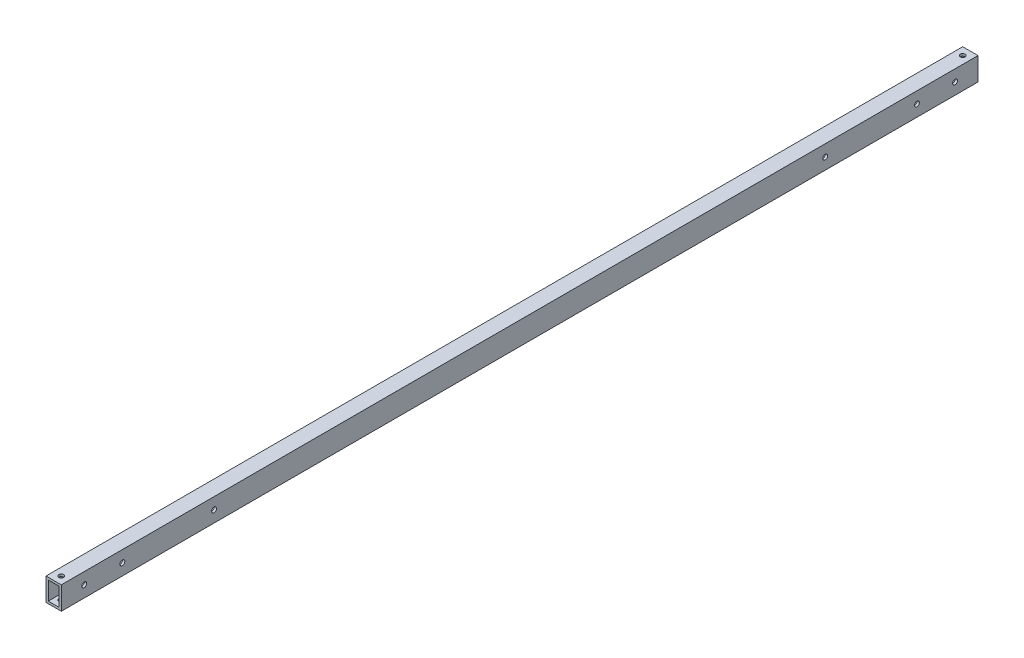
ISO-10303-21;
HEADER;
FILE_DESCRIPTION(('STEP AP214'),'2;1');
FILE_NAME('part.step','',(''),(''),'','','');
FILE_SCHEMA(('AUTOMOTIVE_DESIGN { 1 0 10303 214 1 1 1 1 }'));
ENDSEC;
DATA;
#1=APPLICATION_CONTEXT('core data for automotive mechanical design processes');
#2=APPLICATION_PROTOCOL_DEFINITION('international standard','automotive_design',2000,#1);
#3=PRODUCT_CONTEXT('',#1,'mechanical');
#4=PRODUCT('Part','Part','',(#3));
#5=PRODUCT_RELATED_PRODUCT_CATEGORY('part','',(#4));
#6=PRODUCT_DEFINITION_FORMATION('','',#4);
#7=PRODUCT_DEFINITION_CONTEXT('part definition',#1,'design');
#8=PRODUCT_DEFINITION('design','',#6,#7);
#9=PRODUCT_DEFINITION_SHAPE('','',#8);
#10=(LENGTH_UNIT() NAMED_UNIT(*) SI_UNIT(.MILLI.,.METRE.));
#11=(NAMED_UNIT(*) PLANE_ANGLE_UNIT() SI_UNIT($,.RADIAN.));
#12=(NAMED_UNIT(*) SI_UNIT($,.STERADIAN.) SOLID_ANGLE_UNIT());
#13=UNCERTAINTY_MEASURE_WITH_UNIT(LENGTH_MEASURE(1.E-05),#10,'distance_accuracy_value','');
#14=(GEOMETRIC_REPRESENTATION_CONTEXT(3) GLOBAL_UNCERTAINTY_ASSIGNED_CONTEXT((#13)) GLOBAL_UNIT_ASSIGNED_CONTEXT((#10,
#11,#12)) REPRESENTATION_CONTEXT('',''));
#15=CARTESIAN_POINT('',(0.,0.,0.));
#16=DIRECTION('',(0.,0.,1.));
#17=DIRECTION('',(1.,0.,0.));
#18=AXIS2_PLACEMENT_3D('',#15,#16,#17);
#19=CARTESIAN_POINT('',(0.,0.,600.));
#20=DIRECTION('',(0.,0.,1.));
#21=DIRECTION('',(1.,0.,0.));
#22=AXIS2_PLACEMENT_3D('',#19,#20,#21);
#23=PLANE('',#22);
#24=DIRECTION('',(0.,1.,0.));
#25=VECTOR('',#24,1.);
#26=CARTESIAN_POINT('',(5.,-7.5,600.));
#27=LINE('',#26,#25);
#28=CARTESIAN_POINT('',(5.,-7.5,600.));
#29=VERTEX_POINT('',#28);
#30=CARTESIAN_POINT('',(5.,7.5,600.));
#31=VERTEX_POINT('',#30);
#32=EDGE_CURVE('E164',#29,#31,#27,.T.);
#33=ORIENTED_EDGE('',*,*,#32,.T.);
#34=DIRECTION('',(-1.,0.,0.));
#35=VECTOR('',#34,1.);
#36=CARTESIAN_POINT('',(-5.,7.5,600.));
#37=LINE('',#36,#35);
#38=CARTESIAN_POINT('',(-5.,7.5,600.));
#39=VERTEX_POINT('',#38);
#40=EDGE_CURVE('E167',#31,#39,#37,.T.);
#41=ORIENTED_EDGE('',*,*,#40,.T.);
#42=DIRECTION('',(0.,-1.,0.));
#43=VECTOR('',#42,1.);
#44=CARTESIAN_POINT('',(-5.,-7.5,600.));
#45=LINE('',#44,#43);
#46=CARTESIAN_POINT('',(-5.,-7.5,600.));
#47=VERTEX_POINT('',#46);
#48=EDGE_CURVE('E170',#39,#47,#45,.T.);
#49=ORIENTED_EDGE('',*,*,#48,.T.);
#50=DIRECTION('',(1.,0.,0.));
#51=VECTOR('',#50,1.);
#52=CARTESIAN_POINT('',(-5.,-7.5,600.));
#53=LINE('',#52,#51);
#54=EDGE_CURVE('E172',#47,#29,#53,.T.);
#55=ORIENTED_EDGE('',*,*,#54,.T.);
#56=EDGE_LOOP('',(#33,#41,#49,#55));
#57=FACE_BOUND('',#56,.T.);
#58=DIRECTION('',(-1.,0.,0.));
#59=VECTOR('',#58,1.);
#60=CARTESIAN_POINT('',(0.,6.,600.));
#61=LINE('',#60,#59);
#62=CARTESIAN_POINT('',(3.5,6.,600.));
#63=VERTEX_POINT('',#62);
#64=CARTESIAN_POINT('',(-3.5,6.,600.));
#65=VERTEX_POINT('',#64);
#66=EDGE_CURVE('E134',#63,#65,#61,.T.);
#67=ORIENTED_EDGE('',*,*,#66,.F.);
#68=DIRECTION('',(0.,1.,0.));
#69=VECTOR('',#68,1.);
#70=CARTESIAN_POINT('',(3.5,0.,600.));
#71=LINE('',#70,#69);
#72=CARTESIAN_POINT('',(3.5,-6.,600.));
#73=VERTEX_POINT('',#72);
#74=EDGE_CURVE('E126',#73,#63,#71,.T.);
#75=ORIENTED_EDGE('',*,*,#74,.F.);
#76=DIRECTION('',(1.,0.,0.));
#77=VECTOR('',#76,1.);
#78=CARTESIAN_POINT('',(0.,-6.,600.));
#79=LINE('',#78,#77);
#80=CARTESIAN_POINT('',(-3.5,-6.,600.));
#81=VERTEX_POINT('',#80);
#82=EDGE_CURVE('E148',#81,#73,#79,.T.);
#83=ORIENTED_EDGE('',*,*,#82,.F.);
#84=DIRECTION('',(0.,-1.,0.));
#85=VECTOR('',#84,1.);
#86=CARTESIAN_POINT('',(-3.5,0.,600.));
#87=LINE('',#86,#85);
#88=EDGE_CURVE('E146',#65,#81,#87,.T.);
#89=ORIENTED_EDGE('',*,*,#88,.F.);
#90=EDGE_LOOP('',(#67,#75,#83,#89));
#91=FACE_BOUND('',#90,.T.);
#92=ADVANCED_FACE('F59',(#57,#91),#23,.T.);
#93=CARTESIAN_POINT('',(0.,0.,0.));
#94=DIRECTION('',(0.,0.,1.));
#95=DIRECTION('',(1.,0.,0.));
#96=AXIS2_PLACEMENT_3D('',#93,#94,#95);
#97=PLANE('',#96);
#98=DIRECTION('',(0.,1.,0.));
#99=VECTOR('',#98,1.);
#100=CARTESIAN_POINT('',(5.,-7.5,0.));
#101=LINE('',#100,#99);
#102=CARTESIAN_POINT('',(5.,-7.5,0.));
#103=VERTEX_POINT('',#102);
#104=CARTESIAN_POINT('',(5.,7.5,0.));
#105=VERTEX_POINT('',#104);
#106=EDGE_CURVE('E142',#103,#105,#101,.T.);
#107=ORIENTED_EDGE('',*,*,#106,.F.);
#108=DIRECTION('',(1.,0.,0.));
#109=VECTOR('',#108,1.);
#110=CARTESIAN_POINT('',(-5.,-7.5,0.));
#111=LINE('',#110,#109);
#112=CARTESIAN_POINT('',(-5.,-7.5,0.));
#113=VERTEX_POINT('',#112);
#114=EDGE_CURVE('E168',#113,#103,#111,.T.);
#115=ORIENTED_EDGE('',*,*,#114,.F.);
#116=DIRECTION('',(0.,-1.,0.));
#117=VECTOR('',#116,1.);
#118=CARTESIAN_POINT('',(-5.,-7.5,0.));
#119=LINE('',#118,#117);
#120=CARTESIAN_POINT('',(-5.,7.5,0.));
#121=VERTEX_POINT('',#120);
#122=EDGE_CURVE('E179',#121,#113,#119,.T.);
#123=ORIENTED_EDGE('',*,*,#122,.F.);
#124=DIRECTION('',(-1.,0.,0.));
#125=VECTOR('',#124,1.);
#126=CARTESIAN_POINT('',(-5.,7.5,0.));
#127=LINE('',#126,#125);
#128=EDGE_CURVE('E177',#105,#121,#127,.T.);
#129=ORIENTED_EDGE('',*,*,#128,.F.);
#130=EDGE_LOOP('',(#107,#115,#123,#129));
#131=FACE_BOUND('',#130,.T.);
#132=DIRECTION('',(0.,1.,0.));
#133=VECTOR('',#132,1.);
#134=CARTESIAN_POINT('',(3.5,0.,0.));
#135=LINE('',#134,#133);
#136=CARTESIAN_POINT('',(3.5,-6.,0.));
#137=VERTEX_POINT('',#136);
#138=CARTESIAN_POINT('',(3.5,6.,0.));
#139=VERTEX_POINT('',#138);
#140=EDGE_CURVE('E84',#137,#139,#135,.T.);
#141=ORIENTED_EDGE('',*,*,#140,.T.);
#142=DIRECTION('',(-1.,0.,0.));
#143=VECTOR('',#142,1.);
#144=CARTESIAN_POINT('',(0.,6.,0.));
#145=LINE('',#144,#143);
#146=CARTESIAN_POINT('',(-3.5,6.,0.));
#147=VERTEX_POINT('',#146);
#148=EDGE_CURVE('E141',#139,#147,#145,.T.);
#149=ORIENTED_EDGE('',*,*,#148,.T.);
#150=DIRECTION('',(0.,-1.,0.));
#151=VECTOR('',#150,1.);
#152=CARTESIAN_POINT('',(-3.5,0.,0.));
#153=LINE('',#152,#151);
#154=CARTESIAN_POINT('',(-3.5,-6.,0.));
#155=VERTEX_POINT('',#154);
#156=EDGE_CURVE('E156',#147,#155,#153,.T.);
#157=ORIENTED_EDGE('',*,*,#156,.T.);
#158=DIRECTION('',(1.,0.,0.));
#159=VECTOR('',#158,1.);
#160=CARTESIAN_POINT('',(0.,-6.,0.));
#161=LINE('',#160,#159);
#162=EDGE_CURVE('E135',#155,#137,#161,.T.);
#163=ORIENTED_EDGE('',*,*,#162,.T.);
#164=EDGE_LOOP('',(#141,#149,#157,#163));
#165=FACE_BOUND('',#164,.T.);
#166=ADVANCED_FACE('F276',(#131,#165),#97,.F.);
#167=CARTESIAN_POINT('',(5.,-7.5,600.));
#168=DIRECTION('',(-1.,0.,0.));
#169=DIRECTION('',(0.,0.,1.));
#170=AXIS2_PLACEMENT_3D('',#167,#168,#169);
#171=PLANE('',#170);
#172=CARTESIAN_POINT('',(5.,0.,15.));
#173=DIRECTION('',(1.,0.,0.));
#174=DIRECTION('',(0.,0.,1.));
#175=AXIS2_PLACEMENT_3D('',#172,#173,#174);
#176=CIRCLE('',#175,1.59999999999996);
#177=CARTESIAN_POINT('',(5.,0.,16.6));
#178=VERTEX_POINT('',#177);
#179=EDGE_CURVE('E328',#178,#178,#176,.T.);
#180=ORIENTED_EDGE('',*,*,#179,.F.);
#181=EDGE_LOOP('',(#180));
#182=FACE_BOUND('',#181,.T.);
#183=CARTESIAN_POINT('',(5.,0.,40.));
#184=DIRECTION('',(1.,0.,0.));
#185=DIRECTION('',(0.,0.,1.));
#186=AXIS2_PLACEMENT_3D('',#183,#184,#185);
#187=CIRCLE('',#186,1.60000000000001);
#188=CARTESIAN_POINT('',(5.,0.,41.6));
#189=VERTEX_POINT('',#188);
#190=EDGE_CURVE('E361',#189,#189,#187,.T.);
#191=ORIENTED_EDGE('',*,*,#190,.F.);
#192=EDGE_LOOP('',(#191));
#193=FACE_BOUND('',#192,.T.);
#194=CARTESIAN_POINT('',(5.,0.,500.));
#195=DIRECTION('',(1.,0.,0.));
#196=DIRECTION('',(0.,0.,-1.));
#197=AXIS2_PLACEMENT_3D('',#194,#195,#196);
#198=CIRCLE('',#197,1.59999999999996);
#199=CARTESIAN_POINT('',(5.,0.,498.4));
#200=VERTEX_POINT('',#199);
#201=EDGE_CURVE('E365',#200,#200,#198,.T.);
#202=ORIENTED_EDGE('',*,*,#201,.F.);
#203=EDGE_LOOP('',(#202));
#204=FACE_BOUND('',#203,.T.);
#205=CARTESIAN_POINT('',(5.,0.,100.));
#206=DIRECTION('',(1.,0.,0.));
#207=DIRECTION('',(0.,0.,1.));
#208=AXIS2_PLACEMENT_3D('',#205,#206,#207);
#209=CIRCLE('',#208,1.59999999999996);
#210=CARTESIAN_POINT('',(5.,0.,101.6));
#211=VERTEX_POINT('',#210);
#212=EDGE_CURVE('E369',#211,#211,#209,.T.);
#213=ORIENTED_EDGE('',*,*,#212,.F.);
#214=EDGE_LOOP('',(#213));
#215=FACE_BOUND('',#214,.T.);
#216=CARTESIAN_POINT('',(5.,0.,585.));
#217=DIRECTION('',(1.,0.,0.));
#218=DIRECTION('',(0.,0.,-1.));
#219=AXIS2_PLACEMENT_3D('',#216,#217,#218);
#220=CIRCLE('',#219,1.59999999999991);
#221=CARTESIAN_POINT('',(5.,0.,583.4));
#222=VERTEX_POINT('',#221);
#223=EDGE_CURVE('E372',#222,#222,#220,.T.);
#224=ORIENTED_EDGE('',*,*,#223,.F.);
#225=EDGE_LOOP('',(#224));
#226=FACE_BOUND('',#225,.T.);
#227=CARTESIAN_POINT('',(5.,0.,560.));
#228=DIRECTION('',(1.,0.,0.));
#229=DIRECTION('',(0.,0.,-1.));
#230=AXIS2_PLACEMENT_3D('',#227,#228,#229);
#231=CIRCLE('',#230,1.59999999999991);
#232=CARTESIAN_POINT('',(5.,0.,558.4));
#233=VERTEX_POINT('',#232);
#234=EDGE_CURVE('E323',#233,#233,#231,.T.);
#235=ORIENTED_EDGE('',*,*,#234,.F.);
#236=EDGE_LOOP('',(#235));
#237=FACE_BOUND('',#236,.T.);
#238=ORIENTED_EDGE('',*,*,#106,.T.);
#239=DIRECTION('',(0.,0.,-1.));
#240=VECTOR('',#239,1.);
#241=CARTESIAN_POINT('',(5.,7.5,600.));
#242=LINE('',#241,#240);
#243=EDGE_CURVE('E12',#31,#105,#242,.T.);
#244=ORIENTED_EDGE('',*,*,#243,.F.);
#245=ORIENTED_EDGE('',*,*,#32,.F.);
#246=DIRECTION('',(0.,0.,-1.));
#247=VECTOR('',#246,1.);
#248=CARTESIAN_POINT('',(5.,-7.5,600.));
#249=LINE('',#248,#247);
#250=EDGE_CURVE('E174',#29,#103,#249,.T.);
#251=ORIENTED_EDGE('',*,*,#250,.T.);
#252=EDGE_LOOP('',(#238,#244,#245,#251));
#253=FACE_BOUND('',#252,.T.);
#254=ADVANCED_FACE('F61',(#182,#193,#204,#215,#226,#237,#253),#171,.F.);
#255=CARTESIAN_POINT('',(-5.,7.5,600.));
#256=DIRECTION('',(0.,-1.,0.));
#257=DIRECTION('',(0.,0.,-1.));
#258=AXIS2_PLACEMENT_3D('',#255,#256,#257);
#259=PLANE('',#258);
#260=CARTESIAN_POINT('',(0.,7.5,595.));
#261=DIRECTION('',(0.,1.,0.));
#262=DIRECTION('',(0.,0.,1.));
#263=AXIS2_PLACEMENT_3D('',#260,#261,#262);
#264=CIRCLE('',#263,1.60000000000001);
#265=CARTESIAN_POINT('',(0.,7.5,596.6));
#266=VERTEX_POINT('',#265);
#267=EDGE_CURVE('E233',#266,#266,#264,.T.);
#268=ORIENTED_EDGE('',*,*,#267,.F.);
#269=EDGE_LOOP('',(#268));
#270=FACE_BOUND('',#269,.T.);
#271=CARTESIAN_POINT('',(0.,7.5,5.));
#272=DIRECTION('',(0.,1.,0.));
#273=DIRECTION('',(0.,0.,-1.));
#274=AXIS2_PLACEMENT_3D('',#271,#272,#273);
#275=CIRCLE('',#274,1.6);
#276=CARTESIAN_POINT('',(0.,7.5,3.4));
#277=VERTEX_POINT('',#276);
#278=EDGE_CURVE('E230',#277,#277,#275,.T.);
#279=ORIENTED_EDGE('',*,*,#278,.F.);
#280=EDGE_LOOP('',(#279));
#281=FACE_BOUND('',#280,.T.);
#282=ORIENTED_EDGE('',*,*,#128,.T.);
#283=DIRECTION('',(0.,0.,-1.));
#284=VECTOR('',#283,1.);
#285=CARTESIAN_POINT('',(-5.,7.5,600.));
#286=LINE('',#285,#284);
#287=EDGE_CURVE('E68',#39,#121,#286,.T.);
#288=ORIENTED_EDGE('',*,*,#287,.F.);
#289=ORIENTED_EDGE('',*,*,#40,.F.);
#290=ORIENTED_EDGE('',*,*,#243,.T.);
#291=EDGE_LOOP('',(#282,#288,#289,#290));
#292=FACE_BOUND('',#291,.T.);
#293=ADVANCED_FACE('F262',(#270,#281,#292),#259,.F.);
#294=CARTESIAN_POINT('',(-5.,-7.5,600.));
#295=DIRECTION('',(1.,0.,0.));
#296=DIRECTION('',(0.,0.,-1.));
#297=AXIS2_PLACEMENT_3D('',#294,#295,#296);
#298=PLANE('',#297);
#299=CARTESIAN_POINT('',(-5.,0.,15.));
#300=DIRECTION('',(1.,0.,0.));
#301=DIRECTION('',(0.,0.,1.));
#302=AXIS2_PLACEMENT_3D('',#299,#300,#301);
#303=CIRCLE('',#302,1.59999999999996);
#304=CARTESIAN_POINT('',(-5.,0.,16.6));
#305=VERTEX_POINT('',#304);
#306=EDGE_CURVE('E303',#305,#305,#303,.T.);
#307=ORIENTED_EDGE('',*,*,#306,.T.);
#308=EDGE_LOOP('',(#307));
#309=FACE_BOUND('',#308,.T.);
#310=CARTESIAN_POINT('',(-5.,0.,40.));
#311=DIRECTION('',(1.,0.,0.));
#312=DIRECTION('',(0.,0.,1.));
#313=AXIS2_PLACEMENT_3D('',#310,#311,#312);
#314=CIRCLE('',#313,1.60000000000001);
#315=CARTESIAN_POINT('',(-5.,0.,41.6));
#316=VERTEX_POINT('',#315);
#317=EDGE_CURVE('E307',#316,#316,#314,.T.);
#318=ORIENTED_EDGE('',*,*,#317,.T.);
#319=EDGE_LOOP('',(#318));
#320=FACE_BOUND('',#319,.T.);
#321=CARTESIAN_POINT('',(-5.,0.,500.));
#322=DIRECTION('',(1.,0.,0.));
#323=DIRECTION('',(0.,0.,-1.));
#324=AXIS2_PLACEMENT_3D('',#321,#322,#323);
#325=CIRCLE('',#324,1.59999999999996);
#326=CARTESIAN_POINT('',(-5.,0.,498.4));
#327=VERTEX_POINT('',#326);
#328=EDGE_CURVE('E311',#327,#327,#325,.T.);
#329=ORIENTED_EDGE('',*,*,#328,.T.);
#330=EDGE_LOOP('',(#329));
#331=FACE_BOUND('',#330,.T.);
#332=CARTESIAN_POINT('',(-5.,0.,100.));
#333=DIRECTION('',(1.,0.,0.));
#334=DIRECTION('',(0.,0.,1.));
#335=AXIS2_PLACEMENT_3D('',#332,#333,#334);
#336=CIRCLE('',#335,1.59999999999996);
#337=CARTESIAN_POINT('',(-5.,0.,101.6));
#338=VERTEX_POINT('',#337);
#339=EDGE_CURVE('E315',#338,#338,#336,.T.);
#340=ORIENTED_EDGE('',*,*,#339,.T.);
#341=EDGE_LOOP('',(#340));
#342=FACE_BOUND('',#341,.T.);
#343=CARTESIAN_POINT('',(-5.,0.,585.));
#344=DIRECTION('',(1.,0.,0.));
#345=DIRECTION('',(0.,0.,-1.));
#346=AXIS2_PLACEMENT_3D('',#343,#344,#345);
#347=CIRCLE('',#346,1.59999999999991);
#348=CARTESIAN_POINT('',(-5.,0.,583.4));
#349=VERTEX_POINT('',#348);
#350=EDGE_CURVE('E319',#349,#349,#347,.T.);
#351=ORIENTED_EDGE('',*,*,#350,.T.);
#352=EDGE_LOOP('',(#351));
#353=FACE_BOUND('',#352,.T.);
#354=CARTESIAN_POINT('',(-5.,0.,560.));
#355=DIRECTION('',(1.,0.,0.));
#356=DIRECTION('',(0.,0.,-1.));
#357=AXIS2_PLACEMENT_3D('',#354,#355,#356);
#358=CIRCLE('',#357,1.59999999999991);
#359=CARTESIAN_POINT('',(-5.,0.,558.4));
#360=VERTEX_POINT('',#359);
#361=EDGE_CURVE('E201',#360,#360,#358,.T.);
#362=ORIENTED_EDGE('',*,*,#361,.T.);
#363=EDGE_LOOP('',(#362));
#364=FACE_BOUND('',#363,.T.);
#365=ORIENTED_EDGE('',*,*,#122,.T.);
#366=DIRECTION('',(0.,0.,-1.));
#367=VECTOR('',#366,1.);
#368=CARTESIAN_POINT('',(-5.,-7.5,600.));
#369=LINE('',#368,#367);
#370=EDGE_CURVE('E184',#47,#113,#369,.T.);
#371=ORIENTED_EDGE('',*,*,#370,.F.);
#372=ORIENTED_EDGE('',*,*,#48,.F.);
#373=ORIENTED_EDGE('',*,*,#287,.T.);
#374=EDGE_LOOP('',(#365,#371,#372,#373));
#375=FACE_BOUND('',#374,.T.);
#376=ADVANCED_FACE('F265',(#309,#320,#331,#342,#353,#364,#375),#298,.F.);
#377=CARTESIAN_POINT('',(-5.,-7.5,600.));
#378=DIRECTION('',(0.,1.,0.));
#379=DIRECTION('',(0.,0.,1.));
#380=AXIS2_PLACEMENT_3D('',#377,#378,#379);
#381=PLANE('',#380);
#382=CARTESIAN_POINT('',(0.,-7.5,595.));
#383=DIRECTION('',(0.,1.,0.));
#384=DIRECTION('',(0.,0.,1.));
#385=AXIS2_PLACEMENT_3D('',#382,#383,#384);
#386=CIRCLE('',#385,1.60000000000001);
#387=CARTESIAN_POINT('',(0.,-7.5,596.6));
#388=VERTEX_POINT('',#387);
#389=EDGE_CURVE('E193',#388,#388,#386,.T.);
#390=ORIENTED_EDGE('',*,*,#389,.T.);
#391=EDGE_LOOP('',(#390));
#392=FACE_BOUND('',#391,.T.);
#393=CARTESIAN_POINT('',(0.,-7.5,5.));
#394=DIRECTION('',(0.,1.,0.));
#395=DIRECTION('',(0.,0.,-1.));
#396=AXIS2_PLACEMENT_3D('',#393,#394,#395);
#397=CIRCLE('',#396,1.6);
#398=CARTESIAN_POINT('',(0.,-7.5,3.4));
#399=VERTEX_POINT('',#398);
#400=EDGE_CURVE('E236',#399,#399,#397,.T.);
#401=ORIENTED_EDGE('',*,*,#400,.T.);
#402=EDGE_LOOP('',(#401));
#403=FACE_BOUND('',#402,.T.);
#404=ORIENTED_EDGE('',*,*,#114,.T.);
#405=ORIENTED_EDGE('',*,*,#250,.F.);
#406=ORIENTED_EDGE('',*,*,#54,.F.);
#407=ORIENTED_EDGE('',*,*,#370,.T.);
#408=EDGE_LOOP('',(#404,#405,#406,#407));
#409=FACE_BOUND('',#408,.T.);
#410=ADVANCED_FACE('F280',(#392,#403,#409),#381,.F.);
#411=CARTESIAN_POINT('',(3.5,0.,600.));
#412=DIRECTION('',(-1.,0.,0.));
#413=DIRECTION('',(0.,0.,1.));
#414=AXIS2_PLACEMENT_3D('',#411,#412,#413);
#415=PLANE('',#414);
#416=CARTESIAN_POINT('',(3.5,0.,15.));
#417=DIRECTION('',(-1.,0.,0.));
#418=DIRECTION('',(0.,0.,1.));
#419=AXIS2_PLACEMENT_3D('',#416,#417,#418);
#420=CIRCLE('',#419,1.59999999999996);
#421=CARTESIAN_POINT('',(3.5,0.,16.6));
#422=VERTEX_POINT('',#421);
#423=EDGE_CURVE('E227',#422,#422,#420,.T.);
#424=ORIENTED_EDGE('',*,*,#423,.F.);
#425=EDGE_LOOP('',(#424));
#426=FACE_BOUND('',#425,.T.);
#427=CARTESIAN_POINT('',(3.5,0.,40.));
#428=DIRECTION('',(-1.,0.,0.));
#429=DIRECTION('',(0.,0.,1.));
#430=AXIS2_PLACEMENT_3D('',#427,#428,#429);
#431=CIRCLE('',#430,1.60000000000001);
#432=CARTESIAN_POINT('',(3.5,0.,41.6));
#433=VERTEX_POINT('',#432);
#434=EDGE_CURVE('E215',#433,#433,#431,.T.);
#435=ORIENTED_EDGE('',*,*,#434,.F.);
#436=EDGE_LOOP('',(#435));
#437=FACE_BOUND('',#436,.T.);
#438=CARTESIAN_POINT('',(3.5,0.,500.));
#439=DIRECTION('',(-1.,0.,0.));
#440=DIRECTION('',(0.,0.,1.));
#441=AXIS2_PLACEMENT_3D('',#438,#439,#440);
#442=CIRCLE('',#441,1.59999999999996);
#443=CARTESIAN_POINT('',(3.5,0.,501.6));
#444=VERTEX_POINT('',#443);
#445=EDGE_CURVE('E212',#444,#444,#442,.T.);
#446=ORIENTED_EDGE('',*,*,#445,.F.);
#447=EDGE_LOOP('',(#446));
#448=FACE_BOUND('',#447,.T.);
#449=CARTESIAN_POINT('',(3.5,0.,100.));
#450=DIRECTION('',(-1.,0.,0.));
#451=DIRECTION('',(0.,0.,1.));
#452=AXIS2_PLACEMENT_3D('',#449,#450,#451);
#453=CIRCLE('',#452,1.59999999999996);
#454=CARTESIAN_POINT('',(3.5,0.,101.6));
#455=VERTEX_POINT('',#454);
#456=EDGE_CURVE('E209',#455,#455,#453,.T.);
#457=ORIENTED_EDGE('',*,*,#456,.F.);
#458=EDGE_LOOP('',(#457));
#459=FACE_BOUND('',#458,.T.);
#460=CARTESIAN_POINT('',(3.5,0.,585.));
#461=DIRECTION('',(-1.,0.,0.));
#462=DIRECTION('',(0.,0.,1.));
#463=AXIS2_PLACEMENT_3D('',#460,#461,#462);
#464=CIRCLE('',#463,1.59999999999991);
#465=CARTESIAN_POINT('',(3.5,0.,586.6));
#466=VERTEX_POINT('',#465);
#467=EDGE_CURVE('E205',#466,#466,#464,.T.);
#468=ORIENTED_EDGE('',*,*,#467,.F.);
#469=EDGE_LOOP('',(#468));
#470=FACE_BOUND('',#469,.T.);
#471=CARTESIAN_POINT('',(3.5,0.,560.));
#472=DIRECTION('',(-1.,0.,0.));
#473=DIRECTION('',(0.,0.,1.));
#474=AXIS2_PLACEMENT_3D('',#471,#472,#473);
#475=CIRCLE('',#474,1.59999999999991);
#476=CARTESIAN_POINT('',(3.5,0.,561.6));
#477=VERTEX_POINT('',#476);
#478=EDGE_CURVE('E200',#477,#477,#475,.T.);
#479=ORIENTED_EDGE('',*,*,#478,.F.);
#480=EDGE_LOOP('',(#479));
#481=FACE_BOUND('',#480,.T.);
#482=ORIENTED_EDGE('',*,*,#140,.F.);
#483=DIRECTION('',(0.,0.,-1.));
#484=VECTOR('',#483,1.);
#485=CARTESIAN_POINT('',(3.5,-6.,600.));
#486=LINE('',#485,#484);
#487=EDGE_CURVE('E130',#73,#137,#486,.T.);
#488=ORIENTED_EDGE('',*,*,#487,.F.);
#489=ORIENTED_EDGE('',*,*,#74,.T.);
#490=DIRECTION('',(0.,0.,-1.));
#491=VECTOR('',#490,1.);
#492=CARTESIAN_POINT('',(3.5,6.,600.));
#493=LINE('',#492,#491);
#494=EDGE_CURVE('E129',#63,#139,#493,.T.);
#495=ORIENTED_EDGE('',*,*,#494,.T.);
#496=EDGE_LOOP('',(#482,#488,#489,#495));
#497=FACE_BOUND('',#496,.T.);
#498=ADVANCED_FACE('F128',(#426,#437,#448,#459,#470,#481,#497),#415,.T.);
#499=CARTESIAN_POINT('',(0.,6.,600.));
#500=DIRECTION('',(0.,-1.,0.));
#501=DIRECTION('',(0.,0.,-1.));
#502=AXIS2_PLACEMENT_3D('',#499,#500,#501);
#503=PLANE('',#502);
#504=CARTESIAN_POINT('',(0.,6.,595.));
#505=DIRECTION('',(0.,-1.,0.));
#506=DIRECTION('',(0.,0.,-1.));
#507=AXIS2_PLACEMENT_3D('',#504,#505,#506);
#508=CIRCLE('',#507,1.60000000000001);
#509=CARTESIAN_POINT('',(0.,6.,593.4));
#510=VERTEX_POINT('',#509);
#511=EDGE_CURVE('E154',#510,#510,#508,.T.);
#512=ORIENTED_EDGE('',*,*,#511,.F.);
#513=EDGE_LOOP('',(#512));
#514=FACE_BOUND('',#513,.T.);
#515=CARTESIAN_POINT('',(0.,6.,5.));
#516=DIRECTION('',(0.,-1.,0.));
#517=DIRECTION('',(0.,0.,-1.));
#518=AXIS2_PLACEMENT_3D('',#515,#516,#517);
#519=CIRCLE('',#518,1.6);
#520=CARTESIAN_POINT('',(0.,6.,3.4));
#521=VERTEX_POINT('',#520);
#522=EDGE_CURVE('E192',#521,#521,#519,.T.);
#523=ORIENTED_EDGE('',*,*,#522,.F.);
#524=EDGE_LOOP('',(#523));
#525=FACE_BOUND('',#524,.T.);
#526=ORIENTED_EDGE('',*,*,#148,.F.);
#527=ORIENTED_EDGE('',*,*,#494,.F.);
#528=ORIENTED_EDGE('',*,*,#66,.T.);
#529=DIRECTION('',(0.,0.,-1.));
#530=VECTOR('',#529,1.);
#531=CARTESIAN_POINT('',(-3.5,6.,600.));
#532=LINE('',#531,#530);
#533=EDGE_CURVE('E143',#65,#147,#532,.T.);
#534=ORIENTED_EDGE('',*,*,#533,.T.);
#535=EDGE_LOOP('',(#526,#527,#528,#534));
#536=FACE_BOUND('',#535,.T.);
#537=ADVANCED_FACE('F138',(#514,#525,#536),#503,.T.);
#538=CARTESIAN_POINT('',(-3.5,0.,600.));
#539=DIRECTION('',(1.,0.,0.));
#540=DIRECTION('',(0.,0.,-1.));
#541=AXIS2_PLACEMENT_3D('',#538,#539,#540);
#542=PLANE('',#541);
#543=CARTESIAN_POINT('',(-3.5,0.,15.));
#544=DIRECTION('',(1.,0.,0.));
#545=DIRECTION('',(0.,0.,-1.));
#546=AXIS2_PLACEMENT_3D('',#543,#544,#545);
#547=CIRCLE('',#546,1.59999999999996);
#548=CARTESIAN_POINT('',(-3.5,0.,13.4));
#549=VERTEX_POINT('',#548);
#550=EDGE_CURVE('E63',#549,#549,#547,.T.);
#551=ORIENTED_EDGE('',*,*,#550,.F.);
#552=EDGE_LOOP('',(#551));
#553=FACE_BOUND('',#552,.T.);
#554=CARTESIAN_POINT('',(-3.5,0.,40.));
#555=DIRECTION('',(1.,0.,0.));
#556=DIRECTION('',(0.,0.,-1.));
#557=AXIS2_PLACEMENT_3D('',#554,#555,#556);
#558=CIRCLE('',#557,1.60000000000001);
#559=CARTESIAN_POINT('',(-3.5,0.,38.4));
#560=VERTEX_POINT('',#559);
#561=EDGE_CURVE('E213',#560,#560,#558,.T.);
#562=ORIENTED_EDGE('',*,*,#561,.F.);
#563=EDGE_LOOP('',(#562));
#564=FACE_BOUND('',#563,.T.);
#565=CARTESIAN_POINT('',(-3.5,0.,500.));
#566=DIRECTION('',(1.,0.,0.));
#567=DIRECTION('',(0.,0.,-1.));
#568=AXIS2_PLACEMENT_3D('',#565,#566,#567);
#569=CIRCLE('',#568,1.59999999999996);
#570=CARTESIAN_POINT('',(-3.5,0.,498.4));
#571=VERTEX_POINT('',#570);
#572=EDGE_CURVE('E210',#571,#571,#569,.T.);
#573=ORIENTED_EDGE('',*,*,#572,.F.);
#574=EDGE_LOOP('',(#573));
#575=FACE_BOUND('',#574,.T.);
#576=CARTESIAN_POINT('',(-3.5,0.,100.));
#577=DIRECTION('',(1.,0.,0.));
#578=DIRECTION('',(0.,0.,-1.));
#579=AXIS2_PLACEMENT_3D('',#576,#577,#578);
#580=CIRCLE('',#579,1.59999999999996);
#581=CARTESIAN_POINT('',(-3.5,0.,98.4));
#582=VERTEX_POINT('',#581);
#583=EDGE_CURVE('E206',#582,#582,#580,.T.);
#584=ORIENTED_EDGE('',*,*,#583,.F.);
#585=EDGE_LOOP('',(#584));
#586=FACE_BOUND('',#585,.T.);
#587=CARTESIAN_POINT('',(-3.5,0.,585.));
#588=DIRECTION('',(1.,0.,0.));
#589=DIRECTION('',(0.,0.,-1.));
#590=AXIS2_PLACEMENT_3D('',#587,#588,#589);
#591=CIRCLE('',#590,1.59999999999991);
#592=CARTESIAN_POINT('',(-3.5,0.,583.4));
#593=VERTEX_POINT('',#592);
#594=EDGE_CURVE('E202',#593,#593,#591,.T.);
#595=ORIENTED_EDGE('',*,*,#594,.F.);
#596=EDGE_LOOP('',(#595));
#597=FACE_BOUND('',#596,.T.);
#598=CARTESIAN_POINT('',(-3.5,0.,560.));
#599=DIRECTION('',(1.,0.,0.));
#600=DIRECTION('',(0.,0.,-1.));
#601=AXIS2_PLACEMENT_3D('',#598,#599,#600);
#602=CIRCLE('',#601,1.59999999999991);
#603=CARTESIAN_POINT('',(-3.5,0.,558.4));
#604=VERTEX_POINT('',#603);
#605=EDGE_CURVE('E197',#604,#604,#602,.T.);
#606=ORIENTED_EDGE('',*,*,#605,.F.);
#607=EDGE_LOOP('',(#606));
#608=FACE_BOUND('',#607,.T.);
#609=ORIENTED_EDGE('',*,*,#156,.F.);
#610=ORIENTED_EDGE('',*,*,#533,.F.);
#611=ORIENTED_EDGE('',*,*,#88,.T.);
#612=DIRECTION('',(0.,0.,-1.));
#613=VECTOR('',#612,1.);
#614=CARTESIAN_POINT('',(-3.5,-6.,600.));
#615=LINE('',#614,#613);
#616=EDGE_CURVE('E76',#81,#155,#615,.T.);
#617=ORIENTED_EDGE('',*,*,#616,.T.);
#618=EDGE_LOOP('',(#609,#610,#611,#617));
#619=FACE_BOUND('',#618,.T.);
#620=ADVANCED_FACE('F250',(#553,#564,#575,#586,#597,#608,#619),#542,.T.);
#621=CARTESIAN_POINT('',(0.,-6.,600.));
#622=DIRECTION('',(0.,1.,0.));
#623=DIRECTION('',(0.,0.,1.));
#624=AXIS2_PLACEMENT_3D('',#621,#622,#623);
#625=PLANE('',#624);
#626=CARTESIAN_POINT('',(0.,-6.,595.));
#627=DIRECTION('',(0.,1.,0.));
#628=DIRECTION('',(0.,0.,1.));
#629=AXIS2_PLACEMENT_3D('',#626,#627,#628);
#630=CIRCLE('',#629,1.60000000000001);
#631=CARTESIAN_POINT('',(0.,-6.,596.6));
#632=VERTEX_POINT('',#631);
#633=EDGE_CURVE('E194',#632,#632,#630,.T.);
#634=ORIENTED_EDGE('',*,*,#633,.F.);
#635=EDGE_LOOP('',(#634));
#636=FACE_BOUND('',#635,.T.);
#637=CARTESIAN_POINT('',(0.,-6.,5.));
#638=DIRECTION('',(0.,1.,0.));
#639=DIRECTION('',(0.,0.,1.));
#640=AXIS2_PLACEMENT_3D('',#637,#638,#639);
#641=CIRCLE('',#640,1.6);
#642=CARTESIAN_POINT('',(0.,-6.,6.60000000000001));
#643=VERTEX_POINT('',#642);
#644=EDGE_CURVE('E189',#643,#643,#641,.T.);
#645=ORIENTED_EDGE('',*,*,#644,.F.);
#646=EDGE_LOOP('',(#645));
#647=FACE_BOUND('',#646,.T.);
#648=ORIENTED_EDGE('',*,*,#162,.F.);
#649=ORIENTED_EDGE('',*,*,#616,.F.);
#650=ORIENTED_EDGE('',*,*,#82,.T.);
#651=ORIENTED_EDGE('',*,*,#487,.T.);
#652=EDGE_LOOP('',(#648,#649,#650,#651));
#653=FACE_BOUND('',#652,.T.);
#654=ADVANCED_FACE('F413',(#636,#647,#653),#625,.T.);
#655=CARTESIAN_POINT('',(0.,-7.5,5.));
#656=DIRECTION('',(0.,1.,0.));
#657=DIRECTION('',(0.,0.,1.));
#658=AXIS2_PLACEMENT_3D('',#655,#656,#657);
#659=CYLINDRICAL_SURFACE('',#658,1.6);
#660=ORIENTED_EDGE('',*,*,#644,.T.);
#661=EDGE_LOOP('',(#660));
#662=FACE_BOUND('',#661,.T.);
#663=ORIENTED_EDGE('',*,*,#400,.F.);
#664=EDGE_LOOP('',(#663));
#665=FACE_BOUND('',#664,.T.);
#666=ADVANCED_FACE('F259',(#662,#665),#659,.F.);
#667=CARTESIAN_POINT('',(0.,-7.5,595.));
#668=DIRECTION('',(0.,1.,0.));
#669=DIRECTION('',(0.,0.,1.));
#670=AXIS2_PLACEMENT_3D('',#667,#668,#669);
#671=CYLINDRICAL_SURFACE('',#670,1.60000000000001);
#672=ORIENTED_EDGE('',*,*,#633,.T.);
#673=EDGE_LOOP('',(#672));
#674=FACE_BOUND('',#673,.T.);
#675=ORIENTED_EDGE('',*,*,#389,.F.);
#676=EDGE_LOOP('',(#675));
#677=FACE_BOUND('',#676,.T.);
#678=ADVANCED_FACE('F257',(#674,#677),#671,.F.);
#679=ORIENTED_EDGE('',*,*,#522,.T.);
#680=EDGE_LOOP('',(#679));
#681=FACE_BOUND('',#680,.T.);
#682=ORIENTED_EDGE('',*,*,#278,.T.);
#683=EDGE_LOOP('',(#682));
#684=FACE_BOUND('',#683,.T.);
#685=ADVANCED_FACE('F254',(#681,#684),#659,.F.);
#686=ORIENTED_EDGE('',*,*,#511,.T.);
#687=EDGE_LOOP('',(#686));
#688=FACE_BOUND('',#687,.T.);
#689=ORIENTED_EDGE('',*,*,#267,.T.);
#690=EDGE_LOOP('',(#689));
#691=FACE_BOUND('',#690,.T.);
#692=ADVANCED_FACE('F245',(#688,#691),#671,.F.);
#693=CARTESIAN_POINT('',(-5.,0.,560.));
#694=DIRECTION('',(1.,0.,0.));
#695=DIRECTION('',(0.,0.,-1.));
#696=AXIS2_PLACEMENT_3D('',#693,#694,#695);
#697=CYLINDRICAL_SURFACE('',#696,1.59999999999991);
#698=ORIENTED_EDGE('',*,*,#605,.T.);
#699=EDGE_LOOP('',(#698));
#700=FACE_BOUND('',#699,.T.);
#701=ORIENTED_EDGE('',*,*,#361,.F.);
#702=EDGE_LOOP('',(#701));
#703=FACE_BOUND('',#702,.T.);
#704=ADVANCED_FACE('F348',(#700,#703),#697,.F.);
#705=CARTESIAN_POINT('',(-5.,0.,585.));
#706=DIRECTION('',(1.,0.,0.));
#707=DIRECTION('',(0.,0.,-1.));
#708=AXIS2_PLACEMENT_3D('',#705,#706,#707);
#709=CYLINDRICAL_SURFACE('',#708,1.59999999999991);
#710=ORIENTED_EDGE('',*,*,#594,.T.);
#711=EDGE_LOOP('',(#710));
#712=FACE_BOUND('',#711,.T.);
#713=ORIENTED_EDGE('',*,*,#350,.F.);
#714=EDGE_LOOP('',(#713));
#715=FACE_BOUND('',#714,.T.);
#716=ADVANCED_FACE('F397',(#712,#715),#709,.F.);
#717=CARTESIAN_POINT('',(-5.,0.,100.));
#718=DIRECTION('',(1.,0.,0.));
#719=DIRECTION('',(0.,0.,-1.));
#720=AXIS2_PLACEMENT_3D('',#717,#718,#719);
#721=CYLINDRICAL_SURFACE('',#720,1.59999999999996);
#722=ORIENTED_EDGE('',*,*,#583,.T.);
#723=EDGE_LOOP('',(#722));
#724=FACE_BOUND('',#723,.T.);
#725=ORIENTED_EDGE('',*,*,#339,.F.);
#726=EDGE_LOOP('',(#725));
#727=FACE_BOUND('',#726,.T.);
#728=ADVANCED_FACE('F388',(#724,#727),#721,.F.);
#729=CARTESIAN_POINT('',(-5.,0.,500.));
#730=DIRECTION('',(1.,0.,0.));
#731=DIRECTION('',(0.,0.,-1.));
#732=AXIS2_PLACEMENT_3D('',#729,#730,#731);
#733=CYLINDRICAL_SURFACE('',#732,1.59999999999996);
#734=ORIENTED_EDGE('',*,*,#572,.T.);
#735=EDGE_LOOP('',(#734));
#736=FACE_BOUND('',#735,.T.);
#737=ORIENTED_EDGE('',*,*,#328,.F.);
#738=EDGE_LOOP('',(#737));
#739=FACE_BOUND('',#738,.T.);
#740=ADVANCED_FACE('F395',(#736,#739),#733,.F.);
#741=CARTESIAN_POINT('',(-5.,0.,40.));
#742=DIRECTION('',(1.,0.,0.));
#743=DIRECTION('',(0.,0.,-1.));
#744=AXIS2_PLACEMENT_3D('',#741,#742,#743);
#745=CYLINDRICAL_SURFACE('',#744,1.60000000000001);
#746=ORIENTED_EDGE('',*,*,#561,.T.);
#747=EDGE_LOOP('',(#746));
#748=FACE_BOUND('',#747,.T.);
#749=ORIENTED_EDGE('',*,*,#317,.F.);
#750=EDGE_LOOP('',(#749));
#751=FACE_BOUND('',#750,.T.);
#752=ADVANCED_FACE('F405',(#748,#751),#745,.F.);
#753=CARTESIAN_POINT('',(-5.,0.,15.));
#754=DIRECTION('',(1.,0.,0.));
#755=DIRECTION('',(0.,0.,-1.));
#756=AXIS2_PLACEMENT_3D('',#753,#754,#755);
#757=CYLINDRICAL_SURFACE('',#756,1.59999999999996);
#758=ORIENTED_EDGE('',*,*,#550,.T.);
#759=EDGE_LOOP('',(#758));
#760=FACE_BOUND('',#759,.T.);
#761=ORIENTED_EDGE('',*,*,#306,.F.);
#762=EDGE_LOOP('',(#761));
#763=FACE_BOUND('',#762,.T.);
#764=ADVANCED_FACE('F346',(#760,#763),#757,.F.);
#765=ORIENTED_EDGE('',*,*,#478,.T.);
#766=EDGE_LOOP('',(#765));
#767=FACE_BOUND('',#766,.T.);
#768=ORIENTED_EDGE('',*,*,#234,.T.);
#769=EDGE_LOOP('',(#768));
#770=FACE_BOUND('',#769,.T.);
#771=ADVANCED_FACE('F343',(#767,#770),#697,.F.);
#772=ORIENTED_EDGE('',*,*,#467,.T.);
#773=EDGE_LOOP('',(#772));
#774=FACE_BOUND('',#773,.T.);
#775=ORIENTED_EDGE('',*,*,#223,.T.);
#776=EDGE_LOOP('',(#775));
#777=FACE_BOUND('',#776,.T.);
#778=ADVANCED_FACE('F335',(#774,#777),#709,.F.);
#779=ORIENTED_EDGE('',*,*,#456,.T.);
#780=EDGE_LOOP('',(#779));
#781=FACE_BOUND('',#780,.T.);
#782=ORIENTED_EDGE('',*,*,#212,.T.);
#783=EDGE_LOOP('',(#782));
#784=FACE_BOUND('',#783,.T.);
#785=ADVANCED_FACE('F383',(#781,#784),#721,.F.);
#786=ORIENTED_EDGE('',*,*,#445,.T.);
#787=EDGE_LOOP('',(#786));
#788=FACE_BOUND('',#787,.T.);
#789=ORIENTED_EDGE('',*,*,#201,.T.);
#790=EDGE_LOOP('',(#789));
#791=FACE_BOUND('',#790,.T.);
#792=ADVANCED_FACE('F385',(#788,#791),#733,.F.);
#793=ORIENTED_EDGE('',*,*,#434,.T.);
#794=EDGE_LOOP('',(#793));
#795=FACE_BOUND('',#794,.T.);
#796=ORIENTED_EDGE('',*,*,#190,.T.);
#797=EDGE_LOOP('',(#796));
#798=FACE_BOUND('',#797,.T.);
#799=ADVANCED_FACE('F393',(#795,#798),#745,.F.);
#800=ORIENTED_EDGE('',*,*,#423,.T.);
#801=EDGE_LOOP('',(#800));
#802=FACE_BOUND('',#801,.T.);
#803=ORIENTED_EDGE('',*,*,#179,.T.);
#804=EDGE_LOOP('',(#803));
#805=FACE_BOUND('',#804,.T.);
#806=ADVANCED_FACE('F438',(#802,#805),#757,.F.);
#807=CLOSED_SHELL('',(#92,#166,#254,#293,#376,#410,#498,#537,#620,#654,#666,#678,#685,#692,#704,
#716,#728,#740,#752,#764,#771,#778,#785,#792,#799,#806));
#808=MANIFOLD_SOLID_BREP('B2',#807);
#809=ADVANCED_BREP_SHAPE_REPRESENTATION('',(#18,#808),#14);
#810=SHAPE_DEFINITION_REPRESENTATION(#9,#809);
ENDSEC;
END-ISO-10303-21;
